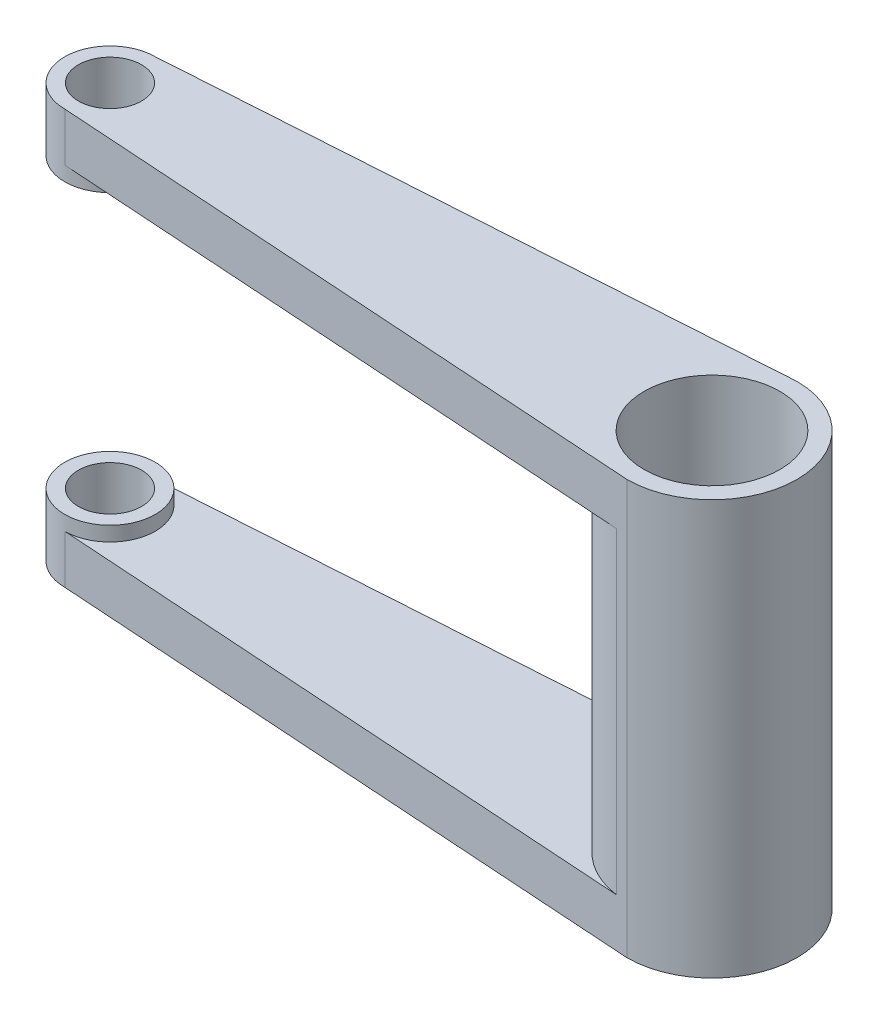
ISO-10303-21;
HEADER;
FILE_DESCRIPTION(('STEP AP214'),'2;1');
FILE_NAME('part.step','',(''),(''),'','','');
FILE_SCHEMA(('AUTOMOTIVE_DESIGN { 1 0 10303 214 1 1 1 1 }'));
ENDSEC;
DATA;
#1=APPLICATION_CONTEXT('core data for automotive mechanical design processes');
#2=APPLICATION_PROTOCOL_DEFINITION('international standard','automotive_design',2000,#1);
#3=PRODUCT_CONTEXT('',#1,'mechanical');
#4=PRODUCT('Part','Part','',(#3));
#5=PRODUCT_RELATED_PRODUCT_CATEGORY('part','',(#4));
#6=PRODUCT_DEFINITION_FORMATION('','',#4);
#7=PRODUCT_DEFINITION_CONTEXT('part definition',#1,'design');
#8=PRODUCT_DEFINITION('design','',#6,#7);
#9=PRODUCT_DEFINITION_SHAPE('','',#8);
#10=(LENGTH_UNIT() NAMED_UNIT(*) SI_UNIT(.MILLI.,.METRE.));
#11=(NAMED_UNIT(*) PLANE_ANGLE_UNIT() SI_UNIT($,.RADIAN.));
#12=(NAMED_UNIT(*) SI_UNIT($,.STERADIAN.) SOLID_ANGLE_UNIT());
#13=UNCERTAINTY_MEASURE_WITH_UNIT(LENGTH_MEASURE(1.E-05),#10,'distance_accuracy_value','');
#14=(GEOMETRIC_REPRESENTATION_CONTEXT(3) GLOBAL_UNCERTAINTY_ASSIGNED_CONTEXT((#13)) GLOBAL_UNIT_ASSIGNED_CONTEXT((#10,
#11,#12)) REPRESENTATION_CONTEXT('',''));
#15=CARTESIAN_POINT('',(0.,0.,0.));
#16=DIRECTION('',(0.,0.,1.));
#17=DIRECTION('',(1.,0.,0.));
#18=AXIS2_PLACEMENT_3D('',#15,#16,#17);
#19=CARTESIAN_POINT('',(5.95050304685596,13.,0.));
#20=DIRECTION('',(0.,-1.,0.));
#21=DIRECTION('',(0.,0.,-1.));
#22=AXIS2_PLACEMENT_3D('',#19,#20,#21);
#23=CYLINDRICAL_SURFACE('',#22,6.49890447508658);
#24=CARTESIAN_POINT('',(5.95050304685596,13.,0.));
#25=DIRECTION('',(0.,1.,0.));
#26=DIRECTION('',(0.,0.,1.));
#27=AXIS2_PLACEMENT_3D('',#24,#25,#26);
#28=CIRCLE('',#27,6.49890447508658);
#29=CARTESIAN_POINT('',(5.95050304685596,13.,-6.49890447508657));
#30=VERTEX_POINT('',#29);
#31=EDGE_CURVE('E53',#30,#30,#28,.T.);
#32=CARTESIAN_POINT('',(5.95050304685596,0.,0.));
#33=DIRECTION('',(0.,1.,0.));
#34=DIRECTION('',(0.,0.,1.));
#35=AXIS2_PLACEMENT_3D('',#32,#33,#34);
#36=CIRCLE('',#35,6.49890447508658);
#37=CARTESIAN_POINT('',(5.95050304685596,0.,-6.49890447508657));
#38=VERTEX_POINT('',#37);
#39=EDGE_CURVE('E189',#38,#38,#36,.T.);
#40=CARTESIAN_POINT('',(5.95050304685596,13.,-6.49890447508657));
#41=CARTESIAN_POINT('',(5.95050304685596,12.8645833333333,-6.49890447508657));
#42=CARTESIAN_POINT('',(5.95050304685596,12.7291666666667,-6.49890447508657));
#43=CARTESIAN_POINT('',(5.95050304685596,12.4583333333333,-6.49890447508657));
#44=CARTESIAN_POINT('',(5.95050304685596,12.3229166666667,-6.49890447508657));
#45=CARTESIAN_POINT('',(5.95050304685596,12.0520833333333,-6.49890447508657));
#46=CARTESIAN_POINT('',(5.95050304685596,11.9166666666667,-6.49890447508657));
#47=CARTESIAN_POINT('',(5.95050304685596,11.6458333333333,-6.49890447508657));
#48=CARTESIAN_POINT('',(5.95050304685596,11.5104166666667,-6.49890447508657));
#49=CARTESIAN_POINT('',(5.95050304685596,11.2395833333333,-6.49890447508657));
#50=CARTESIAN_POINT('',(5.95050304685596,11.1041666666667,-6.49890447508657));
#51=CARTESIAN_POINT('',(5.95050304685596,10.8333333333333,-6.49890447508657));
#52=CARTESIAN_POINT('',(5.95050304685596,10.6979166666667,-6.49890447508657));
#53=CARTESIAN_POINT('',(5.95050304685596,10.4270833333333,-6.49890447508657));
#54=CARTESIAN_POINT('',(5.95050304685596,10.2916666666667,-6.49890447508657));
#55=CARTESIAN_POINT('',(5.95050304685596,10.0208333333333,-6.49890447508657));
#56=CARTESIAN_POINT('',(5.95050304685596,9.88541666666667,-6.49890447508657));
#57=CARTESIAN_POINT('',(5.95050304685596,9.61458333333333,-6.49890447508657));
#58=CARTESIAN_POINT('',(5.95050304685596,9.47916666666667,-6.49890447508657));
#59=CARTESIAN_POINT('',(5.95050304685596,9.20833333333333,-6.49890447508657));
#60=CARTESIAN_POINT('',(5.95050304685596,9.07291666666667,-6.49890447508657));
#61=CARTESIAN_POINT('',(5.95050304685596,8.80208333333333,-6.49890447508657));
#62=CARTESIAN_POINT('',(5.95050304685596,8.66666666666667,-6.49890447508657));
#63=CARTESIAN_POINT('',(5.95050304685596,8.39583333333333,-6.49890447508657));
#64=CARTESIAN_POINT('',(5.95050304685596,8.26041666666667,-6.49890447508657));
#65=CARTESIAN_POINT('',(5.95050304685596,7.98958333333333,-6.49890447508657));
#66=CARTESIAN_POINT('',(5.95050304685596,7.85416666666667,-6.49890447508657));
#67=CARTESIAN_POINT('',(5.95050304685596,7.58333333333333,-6.49890447508657));
#68=CARTESIAN_POINT('',(5.95050304685596,7.44791666666667,-6.49890447508657));
#69=CARTESIAN_POINT('',(5.95050304685596,7.17708333333333,-6.49890447508657));
#70=CARTESIAN_POINT('',(5.95050304685596,7.04166666666667,-6.49890447508657));
#71=CARTESIAN_POINT('',(5.95050304685596,6.77083333333333,-6.49890447508657));
#72=CARTESIAN_POINT('',(5.95050304685596,6.63541666666667,-6.49890447508657));
#73=CARTESIAN_POINT('',(5.95050304685596,6.36458333333333,-6.49890447508657));
#74=CARTESIAN_POINT('',(5.95050304685596,6.22916666666667,-6.49890447508657));
#75=CARTESIAN_POINT('',(5.95050304685596,5.95833333333333,-6.49890447508657));
#76=CARTESIAN_POINT('',(5.95050304685596,5.82291666666667,-6.49890447508657));
#77=CARTESIAN_POINT('',(5.95050304685596,5.55208333333333,-6.49890447508657));
#78=CARTESIAN_POINT('',(5.95050304685596,5.41666666666667,-6.49890447508657));
#79=CARTESIAN_POINT('',(5.95050304685596,5.14583333333333,-6.49890447508657));
#80=CARTESIAN_POINT('',(5.95050304685596,5.01041666666667,-6.49890447508657));
#81=CARTESIAN_POINT('',(5.95050304685596,4.73958333333333,-6.49890447508657));
#82=CARTESIAN_POINT('',(5.95050304685596,4.60416666666667,-6.49890447508657));
#83=CARTESIAN_POINT('',(5.95050304685596,4.33333333333333,-6.49890447508657));
#84=CARTESIAN_POINT('',(5.95050304685596,4.19791666666667,-6.49890447508657));
#85=CARTESIAN_POINT('',(5.95050304685596,3.92708333333333,-6.49890447508657));
#86=CARTESIAN_POINT('',(5.95050304685596,3.79166666666667,-6.49890447508657));
#87=CARTESIAN_POINT('',(5.95050304685596,3.52083333333333,-6.49890447508657));
#88=CARTESIAN_POINT('',(5.95050304685596,3.38541666666667,-6.49890447508657));
#89=CARTESIAN_POINT('',(5.95050304685596,3.11458333333333,-6.49890447508657));
#90=CARTESIAN_POINT('',(5.95050304685596,2.97916666666667,-6.49890447508657));
#91=CARTESIAN_POINT('',(5.95050304685596,2.70833333333333,-6.49890447508657));
#92=CARTESIAN_POINT('',(5.95050304685596,2.57291666666667,-6.49890447508657));
#93=CARTESIAN_POINT('',(5.95050304685596,2.30208333333333,-6.49890447508657));
#94=CARTESIAN_POINT('',(5.95050304685596,2.16666666666667,-6.49890447508657));
#95=CARTESIAN_POINT('',(5.95050304685596,1.89583333333333,-6.49890447508657));
#96=CARTESIAN_POINT('',(5.95050304685596,1.76041666666667,-6.49890447508657));
#97=CARTESIAN_POINT('',(5.95050304685596,1.48958333333333,-6.49890447508657));
#98=CARTESIAN_POINT('',(5.95050304685596,1.35416666666667,-6.49890447508657));
#99=CARTESIAN_POINT('',(5.95050304685596,1.08333333333333,-6.49890447508657));
#100=CARTESIAN_POINT('',(5.95050304685596,0.947916666666667,-6.49890447508657));
#101=CARTESIAN_POINT('',(5.95050304685596,0.677083333333334,-6.49890447508657));
#102=CARTESIAN_POINT('',(5.95050304685596,0.541666666666667,-6.49890447508657));
#103=CARTESIAN_POINT('',(5.95050304685596,0.270833333333334,-6.49890447508657));
#104=CARTESIAN_POINT('',(5.95050304685596,0.135416666666667,-6.49890447508657));
#105=CARTESIAN_POINT('',(5.95050304685596,0.,-6.49890447508657));
#106=B_SPLINE_CURVE_WITH_KNOTS('',3,(#40,#41,#42,#43,#44,#45,#46,#47,#48,#49,#50,#51,#52,#53,
#54,#55,#56,#57,#58,#59,#60,#61,#62,#63,#64,#65,#66,#67,#68,#69,#70,#71,#72,#73,#74,#75,#76,#77,
#78,#79,#80,#81,#82,#83,#84,#85,#86,#87,#88,#89,#90,#91,#92,#93,#94,#95,#96,#97,#98,#99,#100,
#101,#102,#103,#104,#105),.UNSPECIFIED.,.F.,.F.,(4,2,2,2,2,2,2,2,2,2,2,2,2,2,2,2,2,2,2,2,2,2,2,
2,2,2,2,2,2,2,2,2,4),(0.,0.406249999999999,0.812499999999999,1.21875,1.625,2.03125,2.4375,
2.84375,3.25,3.65625,4.0625,4.46875,4.875,5.28125,5.6875,6.09375,6.5,6.90625,7.3125,7.71875,
8.125,8.53125,8.9375,9.34375,9.75,10.15625,10.5625,10.96875,11.375,11.78125,12.1875,12.59375,
13.),.UNSPECIFIED.);
#107=EDGE_CURVE('BSEAM45',#30,#38,#106,.T.);
#108=ORIENTED_EDGE('',*,*,#31,.T.);
#109=ORIENTED_EDGE('',*,*,#39,.F.);
#110=ORIENTED_EDGE('',*,*,#107,.T.);
#111=ORIENTED_EDGE('',*,*,#107,.F.);
#112=EDGE_LOOP('',(#108,#110,#109,#111));
#113=FACE_BOUND('',#112,.T.);
#114=ADVANCED_FACE('F45',(#113),#23,.F.);
#115=CARTESIAN_POINT('',(5.95050304685596,13.,0.));
#116=DIRECTION('',(0.,-1.,0.));
#117=DIRECTION('',(0.,0.,-1.));
#118=AXIS2_PLACEMENT_3D('',#115,#116,#117);
#119=CYLINDRICAL_SURFACE('',#118,9.32071602590351);
#120=CARTESIAN_POINT('',(5.95050304685596,10.,0.));
#121=DIRECTION('',(0.,1.,0.));
#122=DIRECTION('',(0.,0.,1.));
#123=AXIS2_PLACEMENT_3D('',#120,#121,#122);
#124=CIRCLE('',#123,9.32071602590351);
#125=CARTESIAN_POINT('',(5.95050304685596,10.,9.32071602590353));
#126=VERTEX_POINT('',#125);
#127=CARTESIAN_POINT('',(5.95050304685596,10.,-9.32071602590349));
#128=VERTEX_POINT('',#127);
#129=EDGE_CURVE('E61',#126,#128,#124,.T.);
#130=ORIENTED_EDGE('',*,*,#129,.T.);
#131=DIRECTION('',(0.,-1.,0.));
#132=VECTOR('',#131,1.);
#133=CARTESIAN_POINT('',(5.95050304685596,10.,-9.32071602590349));
#134=LINE('',#133,#132);
#135=CARTESIAN_POINT('',(5.95050304685596,0.,-9.32071602590349));
#136=VERTEX_POINT('',#135);
#137=EDGE_CURVE('E187',#128,#136,#134,.T.);
#138=ORIENTED_EDGE('',*,*,#137,.T.);
#139=CARTESIAN_POINT('',(5.95050304685596,0.,0.));
#140=DIRECTION('',(0.,1.,0.));
#141=DIRECTION('',(0.,0.,1.));
#142=AXIS2_PLACEMENT_3D('',#139,#140,#141);
#143=CIRCLE('',#142,9.32071602590351);
#144=CARTESIAN_POINT('',(5.95050304685596,0.,9.32071602590353));
#145=VERTEX_POINT('',#144);
#146=EDGE_CURVE('E48',#136,#145,#143,.T.);
#147=ORIENTED_EDGE('',*,*,#146,.T.);
#148=DIRECTION('',(0.,-1.,0.));
#149=VECTOR('',#148,1.);
#150=CARTESIAN_POINT('',(5.95050304685596,10.,9.32071602590353));
#151=LINE('',#150,#149);
#152=EDGE_CURVE('E66',#126,#145,#151,.T.);
#153=ORIENTED_EDGE('',*,*,#152,.F.);
#154=EDGE_LOOP('',(#130,#138,#147,#153));
#155=FACE_BOUND('',#154,.T.);
#156=CARTESIAN_POINT('',(5.95050304685596,13.,0.));
#157=DIRECTION('',(0.,1.,0.));
#158=DIRECTION('',(0.,0.,1.));
#159=AXIS2_PLACEMENT_3D('',#156,#157,#158);
#160=CIRCLE('',#159,9.32071602590351);
#161=CARTESIAN_POINT('',(5.95050304685596,13.,9.32071602590353));
#162=VERTEX_POINT('',#161);
#163=EDGE_CURVE('E11',#162,#162,#160,.T.);
#164=ORIENTED_EDGE('',*,*,#163,.F.);
#165=EDGE_LOOP('',(#164));
#166=FACE_BOUND('',#165,.T.);
#167=ADVANCED_FACE('F194',(#155,#166),#119,.T.);
#168=CARTESIAN_POINT('',(0.,13.,0.));
#169=DIRECTION('',(0.,1.,0.));
#170=DIRECTION('',(0.,0.,1.));
#171=AXIS2_PLACEMENT_3D('',#168,#169,#170);
#172=PLANE('',#171);
#173=ORIENTED_EDGE('',*,*,#31,.F.);
#174=EDGE_LOOP('',(#173));
#175=FACE_BOUND('',#174,.T.);
#176=ORIENTED_EDGE('',*,*,#163,.T.);
#177=EDGE_LOOP('',(#176));
#178=FACE_BOUND('',#177,.T.);
#179=ADVANCED_FACE('F239',(#175,#178),#172,.T.);
#180=CARTESIAN_POINT('',(0.,0.,0.));
#181=DIRECTION('',(0.,1.,0.));
#182=DIRECTION('',(0.,0.,1.));
#183=AXIS2_PLACEMENT_3D('',#180,#181,#182);
#184=PLANE('',#183);
#185=ORIENTED_EDGE('',*,*,#39,.T.);
#186=EDGE_LOOP('',(#185));
#187=FACE_BOUND('',#186,.T.);
#188=ORIENTED_EDGE('',*,*,#146,.F.);
#189=DIRECTION('',(0.997831582915914,0.,-0.0658189344757377));
#190=VECTOR('',#189,1.);
#191=CARTESIAN_POINT('',(-0.586370952264409,0.,-8.88953095540597));
#192=LINE('',#191,#190);
#193=CARTESIAN_POINT('',(129.950503046856,0.,-17.5));
#194=VERTEX_POINT('',#193);
#195=EDGE_CURVE('E174',#136,#194,#192,.T.);
#196=ORIENTED_EDGE('',*,*,#195,.T.);
#197=CARTESIAN_POINT('',(129.950503046856,0.,0.));
#198=DIRECTION('',(0.,1.,0.));
#199=DIRECTION('',(0.,0.,1.));
#200=AXIS2_PLACEMENT_3D('',#197,#198,#199);
#201=CIRCLE('',#200,17.5);
#202=CARTESIAN_POINT('',(129.950503046856,0.,17.5));
#203=VERTEX_POINT('',#202);
#204=EDGE_CURVE('E160',#203,#194,#201,.T.);
#205=ORIENTED_EDGE('',*,*,#204,.F.);
#206=DIRECTION('',(0.997831582915914,0.,0.0658189344757375));
#207=VECTOR('',#206,1.);
#208=CARTESIAN_POINT('',(-0.586370952264409,0.,8.889530955406));
#209=LINE('',#208,#207);
#210=EDGE_CURVE('E118',#145,#203,#209,.T.);
#211=ORIENTED_EDGE('',*,*,#210,.F.);
#212=EDGE_LOOP('',(#188,#196,#205,#211));
#213=FACE_BOUND('',#212,.T.);
#214=CARTESIAN_POINT('',(129.950503046856,0.,0.));
#215=DIRECTION('',(0.,1.,0.));
#216=DIRECTION('',(0.,0.,1.));
#217=AXIS2_PLACEMENT_3D('',#214,#215,#216);
#218=CIRCLE('',#217,13.9749134076325);
#219=CARTESIAN_POINT('',(129.950503046856,0.,13.9749134076325));
#220=VERTEX_POINT('',#219);
#221=EDGE_CURVE('E165',#220,#220,#218,.T.);
#222=ORIENTED_EDGE('',*,*,#221,.T.);
#223=EDGE_LOOP('',(#222));
#224=FACE_BOUND('',#223,.T.);
#225=ADVANCED_FACE('F198',(#187,#213,#224),#184,.F.);
#226=CARTESIAN_POINT('',(-0.586370952264409,10.,-8.88953095540597));
#227=DIRECTION('',(-0.0658189344757377,0.,-0.997831582915914));
#228=DIRECTION('',(-0.997831582915914,0.,0.0658189344757377));
#229=AXIS2_PLACEMENT_3D('',#226,#227,#228);
#230=PLANE('',#229);
#231=ORIENTED_EDGE('',*,*,#195,.F.);
#232=ORIENTED_EDGE('',*,*,#137,.F.);
#233=DIRECTION('',(0.997831582915914,0.,-0.0658189344757377));
#234=VECTOR('',#233,1.);
#235=CARTESIAN_POINT('',(-0.586370952264409,10.,-8.88953095540597));
#236=LINE('',#235,#234);
#237=CARTESIAN_POINT('',(127.651835641774,10.,-17.3483753752567));
#238=VERTEX_POINT('',#237);
#239=EDGE_CURVE('E178',#128,#238,#236,.T.);
#240=ORIENTED_EDGE('',*,*,#239,.T.);
#241=DIRECTION('',(0.,-1.,0.));
#242=VECTOR('',#241,1.);
#243=CARTESIAN_POINT('',(127.651835641774,42.6626032762777,-17.3483753752567));
#244=LINE('',#243,#242);
#245=CARTESIAN_POINT('',(127.651835641774,75.3252065525554,-17.3483753752567));
#246=VERTEX_POINT('',#245);
#247=EDGE_CURVE('E171',#246,#238,#244,.T.);
#248=ORIENTED_EDGE('',*,*,#247,.F.);
#249=DIRECTION('',(0.997831582915914,0.,-0.0658189344757377));
#250=VECTOR('',#249,1.);
#251=CARTESIAN_POINT('',(-0.586370952264409,75.3252065525554,-8.88953095540597));
#252=LINE('',#251,#250);
#253=CARTESIAN_POINT('',(5.95050304685596,75.3252065525554,-9.32071602590349));
#254=VERTEX_POINT('',#253);
#255=EDGE_CURVE('E142',#254,#246,#252,.T.);
#256=ORIENTED_EDGE('',*,*,#255,.F.);
#257=DIRECTION('',(0.,1.,0.));
#258=VECTOR('',#257,1.);
#259=CARTESIAN_POINT('',(5.95050304685596,75.3252065525554,-9.32071602590349));
#260=LINE('',#259,#258);
#261=CARTESIAN_POINT('',(5.95050304685596,85.3252065525553,-9.32071602590349));
#262=VERTEX_POINT('',#261);
#263=EDGE_CURVE('E149',#254,#262,#260,.T.);
#264=ORIENTED_EDGE('',*,*,#263,.T.);
#265=DIRECTION('',(0.997831582915914,0.,-0.0658189344757377));
#266=VECTOR('',#265,1.);
#267=CARTESIAN_POINT('',(-0.586370952264409,85.3252065525553,-8.88953095540597));
#268=LINE('',#267,#266);
#269=CARTESIAN_POINT('',(129.950503046856,85.3252065525553,-17.5));
#270=VERTEX_POINT('',#269);
#271=EDGE_CURVE('E139',#262,#270,#268,.T.);
#272=ORIENTED_EDGE('',*,*,#271,.T.);
#273=DIRECTION('',(0.,-1.,0.));
#274=VECTOR('',#273,1.);
#275=CARTESIAN_POINT('',(129.950503046856,42.6626032762777,-17.5));
#276=LINE('',#275,#274);
#277=EDGE_CURVE('E123',#270,#194,#276,.T.);
#278=ORIENTED_EDGE('',*,*,#277,.T.);
#279=EDGE_LOOP('',(#231,#232,#240,#248,#256,#264,#272,#278));
#280=FACE_BOUND('',#279,.T.);
#281=ADVANCED_FACE('F201',(#280),#230,.T.);
#282=CARTESIAN_POINT('',(-0.586370952264409,10.,8.889530955406));
#283=DIRECTION('',(0.0658189344757375,0.,-0.997831582915914));
#284=DIRECTION('',(-0.997831582915914,0.,-0.0658189344757375));
#285=AXIS2_PLACEMENT_3D('',#282,#283,#284);
#286=PLANE('',#285);
#287=ORIENTED_EDGE('',*,*,#210,.T.);
#288=DIRECTION('',(0.,-1.,0.));
#289=VECTOR('',#288,1.);
#290=CARTESIAN_POINT('',(129.950503046856,42.6626032762777,17.5));
#291=LINE('',#290,#289);
#292=CARTESIAN_POINT('',(129.950503046856,85.3252065525553,17.5));
#293=VERTEX_POINT('',#292);
#294=EDGE_CURVE('E110',#293,#203,#291,.T.);
#295=ORIENTED_EDGE('',*,*,#294,.F.);
#296=DIRECTION('',(0.997831582915914,0.,0.0658189344757375));
#297=VECTOR('',#296,1.);
#298=CARTESIAN_POINT('',(-0.586370952264409,85.3252065525553,8.889530955406));
#299=LINE('',#298,#297);
#300=CARTESIAN_POINT('',(5.95050304685596,85.3252065525553,9.32071602590353));
#301=VERTEX_POINT('',#300);
#302=EDGE_CURVE('E115',#301,#293,#299,.T.);
#303=ORIENTED_EDGE('',*,*,#302,.F.);
#304=DIRECTION('',(0.,1.,0.));
#305=VECTOR('',#304,1.);
#306=CARTESIAN_POINT('',(5.95050304685596,75.3252065525554,9.32071602590353));
#307=LINE('',#306,#305);
#308=CARTESIAN_POINT('',(5.95050304685596,75.3252065525554,9.32071602590353));
#309=VERTEX_POINT('',#308);
#310=EDGE_CURVE('E147',#309,#301,#307,.T.);
#311=ORIENTED_EDGE('',*,*,#310,.F.);
#312=DIRECTION('',(0.997831582915914,0.,0.0658189344757375));
#313=VECTOR('',#312,1.);
#314=CARTESIAN_POINT('',(-0.586370952264409,75.3252065525554,8.889530955406));
#315=LINE('',#314,#313);
#316=CARTESIAN_POINT('',(127.651835641774,75.3252065525553,17.3483753752567));
#317=VERTEX_POINT('',#316);
#318=EDGE_CURVE('E150',#309,#317,#315,.T.);
#319=ORIENTED_EDGE('',*,*,#318,.T.);
#320=DIRECTION('',(0.,-1.,0.));
#321=VECTOR('',#320,1.);
#322=CARTESIAN_POINT('',(127.651835641774,42.6626032762777,17.3483753752567));
#323=LINE('',#322,#321);
#324=CARTESIAN_POINT('',(127.651835641774,10.,17.3483753752567));
#325=VERTEX_POINT('',#324);
#326=EDGE_CURVE('E122',#317,#325,#323,.T.);
#327=ORIENTED_EDGE('',*,*,#326,.T.);
#328=DIRECTION('',(0.997831582915914,0.,0.0658189344757375));
#329=VECTOR('',#328,1.);
#330=CARTESIAN_POINT('',(-0.586370952264409,10.,8.889530955406));
#331=LINE('',#330,#329);
#332=EDGE_CURVE('E182',#126,#325,#331,.T.);
#333=ORIENTED_EDGE('',*,*,#332,.F.);
#334=ORIENTED_EDGE('',*,*,#152,.T.);
#335=EDGE_LOOP('',(#287,#295,#303,#311,#319,#327,#333,#334));
#336=FACE_BOUND('',#335,.T.);
#337=ADVANCED_FACE('F112',(#336),#286,.F.);
#338=CARTESIAN_POINT('',(0.,10.,0.));
#339=DIRECTION('',(0.,1.,0.));
#340=DIRECTION('',(0.,0.,1.));
#341=AXIS2_PLACEMENT_3D('',#338,#339,#340);
#342=PLANE('',#341);
#343=CARTESIAN_POINT('',(129.950503046856,10.,0.));
#344=DIRECTION('',(0.,1.,0.));
#345=DIRECTION('',(0.,0.,1.));
#346=AXIS2_PLACEMENT_3D('',#343,#344,#345);
#347=CIRCLE('',#346,17.5);
#348=EDGE_CURVE('E175',#238,#325,#347,.T.);
#349=ORIENTED_EDGE('',*,*,#348,.F.);
#350=ORIENTED_EDGE('',*,*,#239,.F.);
#351=ORIENTED_EDGE('',*,*,#129,.F.);
#352=ORIENTED_EDGE('',*,*,#332,.T.);
#353=EDGE_LOOP('',(#349,#350,#351,#352));
#354=FACE_BOUND('',#353,.T.);
#355=ADVANCED_FACE('F256',(#354),#342,.T.);
#356=CARTESIAN_POINT('',(129.950503046856,42.6626032762777,0.));
#357=DIRECTION('',(0.,-1.,0.));
#358=DIRECTION('',(0.,0.,-1.));
#359=AXIS2_PLACEMENT_3D('',#356,#357,#358);
#360=CYLINDRICAL_SURFACE('',#359,17.5);
#361=ORIENTED_EDGE('',*,*,#348,.T.);
#362=ORIENTED_EDGE('',*,*,#326,.F.);
#363=CARTESIAN_POINT('',(129.950503046856,75.3252065525554,0.));
#364=DIRECTION('',(0.,1.,0.));
#365=DIRECTION('',(0.,0.,1.));
#366=AXIS2_PLACEMENT_3D('',#363,#364,#365);
#367=CIRCLE('',#366,17.5);
#368=EDGE_CURVE('E138',#246,#317,#367,.T.);
#369=ORIENTED_EDGE('',*,*,#368,.F.);
#370=ORIENTED_EDGE('',*,*,#247,.T.);
#371=EDGE_LOOP('',(#361,#362,#369,#370));
#372=FACE_BOUND('',#371,.T.);
#373=ADVANCED_FACE('F259',(#372),#360,.T.);
#374=ORIENTED_EDGE('',*,*,#204,.T.);
#375=ORIENTED_EDGE('',*,*,#277,.F.);
#376=CARTESIAN_POINT('',(129.950503046856,85.3252065525553,0.));
#377=DIRECTION('',(0.,1.,0.));
#378=DIRECTION('',(0.,0.,1.));
#379=AXIS2_PLACEMENT_3D('',#376,#377,#378);
#380=CIRCLE('',#379,17.5);
#381=EDGE_CURVE('E126',#293,#270,#380,.T.);
#382=ORIENTED_EDGE('',*,*,#381,.F.);
#383=ORIENTED_EDGE('',*,*,#294,.T.);
#384=EDGE_LOOP('',(#374,#375,#382,#383));
#385=FACE_BOUND('',#384,.T.);
#386=ADVANCED_FACE('F127',(#385),#360,.T.);
#387=CARTESIAN_POINT('',(129.950503046856,42.6626032762777,0.));
#388=DIRECTION('',(0.,-1.,0.));
#389=DIRECTION('',(0.,0.,-1.));
#390=AXIS2_PLACEMENT_3D('',#387,#388,#389);
#391=CYLINDRICAL_SURFACE('',#390,13.9749134076325);
#392=ORIENTED_EDGE('',*,*,#221,.F.);
#393=EDGE_LOOP('',(#392));
#394=FACE_BOUND('',#393,.T.);
#395=CARTESIAN_POINT('',(129.950503046856,85.3252065525553,0.));
#396=DIRECTION('',(0.,1.,0.));
#397=DIRECTION('',(0.,0.,1.));
#398=AXIS2_PLACEMENT_3D('',#395,#396,#397);
#399=CIRCLE('',#398,13.9749134076325);
#400=CARTESIAN_POINT('',(129.950503046856,85.3252065525553,13.9749134076325));
#401=VERTEX_POINT('',#400);
#402=EDGE_CURVE('E131',#401,#401,#399,.T.);
#403=ORIENTED_EDGE('',*,*,#402,.T.);
#404=EDGE_LOOP('',(#403));
#405=FACE_BOUND('',#404,.T.);
#406=ADVANCED_FACE('F218',(#394,#405),#391,.F.);
#407=CARTESIAN_POINT('',(5.95050304685596,72.3252065525554,0.));
#408=DIRECTION('',(0.,1.,0.));
#409=DIRECTION('',(0.,0.,-1.));
#410=AXIS2_PLACEMENT_3D('',#407,#408,#409);
#411=CYLINDRICAL_SURFACE('',#410,6.49890447508658);
#412=CARTESIAN_POINT('',(5.95050304685596,72.3252065525554,0.));
#413=DIRECTION('',(0.,1.,0.));
#414=DIRECTION('',(0.,0.,1.));
#415=AXIS2_PLACEMENT_3D('',#412,#413,#414);
#416=CIRCLE('',#415,6.49890447508658);
#417=CARTESIAN_POINT('',(5.95050304685596,72.3252065525553,-6.49890447508657));
#418=VERTEX_POINT('',#417);
#419=EDGE_CURVE('E154',#418,#418,#416,.T.);
#420=CARTESIAN_POINT('',(5.95050304685596,85.3252065525553,0.));
#421=DIRECTION('',(0.,1.,0.));
#422=DIRECTION('',(0.,0.,1.));
#423=AXIS2_PLACEMENT_3D('',#420,#421,#422);
#424=CIRCLE('',#423,6.49890447508658);
#425=CARTESIAN_POINT('',(5.95050304685596,85.3252065525553,-6.49890447508657));
#426=VERTEX_POINT('',#425);
#427=EDGE_CURVE('E153',#426,#426,#424,.T.);
#428=CARTESIAN_POINT('',(5.95050304685596,72.3252065525553,-6.49890447508657));
#429=CARTESIAN_POINT('',(5.95050304685596,72.460623219222,-6.49890447508657));
#430=CARTESIAN_POINT('',(5.95050304685596,72.5960398858887,-6.49890447508657));
#431=CARTESIAN_POINT('',(5.95050304685596,72.866873219222,-6.49890447508657));
#432=CARTESIAN_POINT('',(5.95050304685596,73.0022898858887,-6.49890447508657));
#433=CARTESIAN_POINT('',(5.95050304685596,73.273123219222,-6.49890447508657));
#434=CARTESIAN_POINT('',(5.95050304685596,73.4085398858887,-6.49890447508657));
#435=CARTESIAN_POINT('',(5.95050304685596,73.679373219222,-6.49890447508657));
#436=CARTESIAN_POINT('',(5.95050304685596,73.8147898858887,-6.49890447508657));
#437=CARTESIAN_POINT('',(5.95050304685596,74.085623219222,-6.49890447508657));
#438=CARTESIAN_POINT('',(5.95050304685596,74.2210398858887,-6.49890447508657));
#439=CARTESIAN_POINT('',(5.95050304685596,74.491873219222,-6.49890447508657));
#440=CARTESIAN_POINT('',(5.95050304685596,74.6272898858887,-6.49890447508657));
#441=CARTESIAN_POINT('',(5.95050304685596,74.898123219222,-6.49890447508657));
#442=CARTESIAN_POINT('',(5.95050304685596,75.0335398858887,-6.49890447508657));
#443=CARTESIAN_POINT('',(5.95050304685596,75.304373219222,-6.49890447508657));
#444=CARTESIAN_POINT('',(5.95050304685596,75.4397898858887,-6.49890447508657));
#445=CARTESIAN_POINT('',(5.95050304685596,75.710623219222,-6.49890447508657));
#446=CARTESIAN_POINT('',(5.95050304685596,75.8460398858887,-6.49890447508657));
#447=CARTESIAN_POINT('',(5.95050304685596,76.116873219222,-6.49890447508657));
#448=CARTESIAN_POINT('',(5.95050304685596,76.2522898858887,-6.49890447508657));
#449=CARTESIAN_POINT('',(5.95050304685596,76.523123219222,-6.49890447508657));
#450=CARTESIAN_POINT('',(5.95050304685596,76.6585398858887,-6.49890447508657));
#451=CARTESIAN_POINT('',(5.95050304685596,76.929373219222,-6.49890447508657));
#452=CARTESIAN_POINT('',(5.95050304685596,77.0647898858887,-6.49890447508657));
#453=CARTESIAN_POINT('',(5.95050304685596,77.335623219222,-6.49890447508657));
#454=CARTESIAN_POINT('',(5.95050304685596,77.4710398858887,-6.49890447508657));
#455=CARTESIAN_POINT('',(5.95050304685596,77.741873219222,-6.49890447508657));
#456=CARTESIAN_POINT('',(5.95050304685596,77.8772898858887,-6.49890447508657));
#457=CARTESIAN_POINT('',(5.95050304685596,78.148123219222,-6.49890447508657));
#458=CARTESIAN_POINT('',(5.95050304685596,78.2835398858887,-6.49890447508657));
#459=CARTESIAN_POINT('',(5.95050304685596,78.554373219222,-6.49890447508657));
#460=CARTESIAN_POINT('',(5.95050304685596,78.6897898858887,-6.49890447508657));
#461=CARTESIAN_POINT('',(5.95050304685596,78.960623219222,-6.49890447508657));
#462=CARTESIAN_POINT('',(5.95050304685596,79.0960398858887,-6.49890447508657));
#463=CARTESIAN_POINT('',(5.95050304685596,79.366873219222,-6.49890447508657));
#464=CARTESIAN_POINT('',(5.95050304685596,79.5022898858887,-6.49890447508657));
#465=CARTESIAN_POINT('',(5.95050304685596,79.773123219222,-6.49890447508657));
#466=CARTESIAN_POINT('',(5.95050304685596,79.9085398858887,-6.49890447508657));
#467=CARTESIAN_POINT('',(5.95050304685596,80.179373219222,-6.49890447508657));
#468=CARTESIAN_POINT('',(5.95050304685596,80.3147898858887,-6.49890447508657));
#469=CARTESIAN_POINT('',(5.95050304685596,80.585623219222,-6.49890447508657));
#470=CARTESIAN_POINT('',(5.95050304685596,80.7210398858887,-6.49890447508657));
#471=CARTESIAN_POINT('',(5.95050304685596,80.991873219222,-6.49890447508657));
#472=CARTESIAN_POINT('',(5.95050304685596,81.1272898858887,-6.49890447508657));
#473=CARTESIAN_POINT('',(5.95050304685596,81.398123219222,-6.49890447508657));
#474=CARTESIAN_POINT('',(5.95050304685596,81.5335398858887,-6.49890447508657));
#475=CARTESIAN_POINT('',(5.95050304685596,81.804373219222,-6.49890447508657));
#476=CARTESIAN_POINT('',(5.95050304685596,81.9397898858887,-6.49890447508657));
#477=CARTESIAN_POINT('',(5.95050304685596,82.210623219222,-6.49890447508657));
#478=CARTESIAN_POINT('',(5.95050304685596,82.3460398858887,-6.49890447508657));
#479=CARTESIAN_POINT('',(5.95050304685596,82.616873219222,-6.49890447508657));
#480=CARTESIAN_POINT('',(5.95050304685596,82.7522898858887,-6.49890447508657));
#481=CARTESIAN_POINT('',(5.95050304685596,83.023123219222,-6.49890447508657));
#482=CARTESIAN_POINT('',(5.95050304685596,83.1585398858887,-6.49890447508657));
#483=CARTESIAN_POINT('',(5.95050304685596,83.429373219222,-6.49890447508657));
#484=CARTESIAN_POINT('',(5.95050304685596,83.5647898858887,-6.49890447508657));
#485=CARTESIAN_POINT('',(5.95050304685596,83.835623219222,-6.49890447508657));
#486=CARTESIAN_POINT('',(5.95050304685596,83.9710398858887,-6.49890447508657));
#487=CARTESIAN_POINT('',(5.95050304685596,84.241873219222,-6.49890447508657));
#488=CARTESIAN_POINT('',(5.95050304685596,84.3772898858887,-6.49890447508657));
#489=CARTESIAN_POINT('',(5.95050304685596,84.648123219222,-6.49890447508657));
#490=CARTESIAN_POINT('',(5.95050304685596,84.7835398858887,-6.49890447508657));
#491=CARTESIAN_POINT('',(5.95050304685596,85.054373219222,-6.49890447508657));
#492=CARTESIAN_POINT('',(5.95050304685596,85.1897898858887,-6.49890447508657));
#493=CARTESIAN_POINT('',(5.95050304685596,85.3252065525553,-6.49890447508657));
#494=B_SPLINE_CURVE_WITH_KNOTS('',3,(#428,#429,#430,#431,#432,#433,#434,#435,#436,#437,#438,
#439,#440,#441,#442,#443,#444,#445,#446,#447,#448,#449,#450,#451,#452,#453,#454,#455,#456,#457,
#458,#459,#460,#461,#462,#463,#464,#465,#466,#467,#468,#469,#470,#471,#472,#473,#474,#475,#476,
#477,#478,#479,#480,#481,#482,#483,#484,#485,#486,#487,#488,#489,#490,#491,#492,#493),
.UNSPECIFIED.,.F.,.F.,(4,2,2,2,2,2,2,2,2,2,2,2,2,2,2,2,2,2,2,2,2,2,2,2,2,2,2,2,2,2,2,2,4),(0.,
0.406250000000011,0.812500000000008,1.21875,1.625,2.03125000000001,2.43750000000001,
2.84375000000001,3.25,3.65625,4.06250000000001,4.46875000000001,4.875,5.28125,5.68750000000001,
6.09375000000001,6.50000000000001,6.90625,7.3125,7.71875000000001,8.12500000000001,8.53125,
8.9375,9.34375,9.75000000000001,10.15625,10.5625,10.96875,11.375,11.78125,12.1875,12.59375,13.),.UNSPECIFIED.);
#495=EDGE_CURVE('BSEAM265',#418,#426,#494,.T.);
#496=ORIENTED_EDGE('',*,*,#419,.F.);
#497=ORIENTED_EDGE('',*,*,#427,.T.);
#498=ORIENTED_EDGE('',*,*,#495,.T.);
#499=ORIENTED_EDGE('',*,*,#495,.F.);
#500=EDGE_LOOP('',(#496,#498,#497,#499));
#501=FACE_BOUND('',#500,.T.);
#502=ADVANCED_FACE('F265',(#501),#411,.F.);
#503=CARTESIAN_POINT('',(5.95050304685596,72.3252065525554,0.));
#504=DIRECTION('',(0.,1.,0.));
#505=DIRECTION('',(0.,0.,-1.));
#506=AXIS2_PLACEMENT_3D('',#503,#504,#505);
#507=CYLINDRICAL_SURFACE('',#506,9.32071602590351);
#508=CARTESIAN_POINT('',(5.95050304685596,75.3252065525554,0.));
#509=DIRECTION('',(0.,1.,0.));
#510=DIRECTION('',(0.,0.,1.));
#511=AXIS2_PLACEMENT_3D('',#508,#509,#510);
#512=CIRCLE('',#511,9.32071602590351);
#513=EDGE_CURVE('E209',#309,#254,#512,.T.);
#514=ORIENTED_EDGE('',*,*,#513,.F.);
#515=ORIENTED_EDGE('',*,*,#310,.T.);
#516=CARTESIAN_POINT('',(5.95050304685596,85.3252065525553,0.));
#517=DIRECTION('',(0.,1.,0.));
#518=DIRECTION('',(0.,0.,1.));
#519=AXIS2_PLACEMENT_3D('',#516,#517,#518);
#520=CIRCLE('',#519,9.32071602590351);
#521=EDGE_CURVE('E136',#262,#301,#520,.T.);
#522=ORIENTED_EDGE('',*,*,#521,.F.);
#523=ORIENTED_EDGE('',*,*,#263,.F.);
#524=EDGE_LOOP('',(#514,#515,#522,#523));
#525=FACE_BOUND('',#524,.T.);
#526=CARTESIAN_POINT('',(5.95050304685596,72.3252065525554,0.));
#527=DIRECTION('',(0.,1.,0.));
#528=DIRECTION('',(0.,0.,1.));
#529=AXIS2_PLACEMENT_3D('',#526,#527,#528);
#530=CIRCLE('',#529,9.32071602590351);
#531=CARTESIAN_POINT('',(5.95050304685596,72.3252065525554,9.32071602590353));
#532=VERTEX_POINT('',#531);
#533=EDGE_CURVE('E157',#532,#532,#530,.T.);
#534=ORIENTED_EDGE('',*,*,#533,.T.);
#535=EDGE_LOOP('',(#534));
#536=FACE_BOUND('',#535,.T.);
#537=ADVANCED_FACE('F207',(#525,#536),#507,.T.);
#538=CARTESIAN_POINT('',(0.,72.3252065525554,0.));
#539=DIRECTION('',(0.,-1.,0.));
#540=DIRECTION('',(0.,0.,1.));
#541=AXIS2_PLACEMENT_3D('',#538,#539,#540);
#542=PLANE('',#541);
#543=ORIENTED_EDGE('',*,*,#419,.T.);
#544=EDGE_LOOP('',(#543));
#545=FACE_BOUND('',#544,.T.);
#546=ORIENTED_EDGE('',*,*,#533,.F.);
#547=EDGE_LOOP('',(#546));
#548=FACE_BOUND('',#547,.T.);
#549=ADVANCED_FACE('F221',(#545,#548),#542,.T.);
#550=CARTESIAN_POINT('',(0.,85.3252065525553,0.));
#551=DIRECTION('',(0.,-1.,0.));
#552=DIRECTION('',(0.,0.,1.));
#553=AXIS2_PLACEMENT_3D('',#550,#551,#552);
#554=PLANE('',#553);
#555=ORIENTED_EDGE('',*,*,#427,.F.);
#556=EDGE_LOOP('',(#555));
#557=FACE_BOUND('',#556,.T.);
#558=ORIENTED_EDGE('',*,*,#521,.T.);
#559=ORIENTED_EDGE('',*,*,#302,.T.);
#560=ORIENTED_EDGE('',*,*,#381,.T.);
#561=ORIENTED_EDGE('',*,*,#271,.F.);
#562=EDGE_LOOP('',(#558,#559,#560,#561));
#563=FACE_BOUND('',#562,.T.);
#564=ORIENTED_EDGE('',*,*,#402,.F.);
#565=EDGE_LOOP('',(#564));
#566=FACE_BOUND('',#565,.T.);
#567=ADVANCED_FACE('F133',(#557,#563,#566),#554,.F.);
#568=CARTESIAN_POINT('',(0.,75.3252065525554,0.));
#569=DIRECTION('',(0.,-1.,0.));
#570=DIRECTION('',(0.,0.,1.));
#571=AXIS2_PLACEMENT_3D('',#568,#569,#570);
#572=PLANE('',#571);
#573=ORIENTED_EDGE('',*,*,#368,.T.);
#574=ORIENTED_EDGE('',*,*,#318,.F.);
#575=ORIENTED_EDGE('',*,*,#513,.T.);
#576=ORIENTED_EDGE('',*,*,#255,.T.);
#577=EDGE_LOOP('',(#573,#574,#575,#576));
#578=FACE_BOUND('',#577,.T.);
#579=ADVANCED_FACE('F220',(#578),#572,.T.);
#580=CLOSED_SHELL('',(#114,#167,#179,#225,#281,#337,#355,#373,#386,#406,#502,#537,#549,#567,#579));
#581=MANIFOLD_SOLID_BREP('B2',#580);
#582=ADVANCED_BREP_SHAPE_REPRESENTATION('',(#18,#581),#14);
#583=SHAPE_DEFINITION_REPRESENTATION(#9,#582);
ENDSEC;
END-ISO-10303-21;
